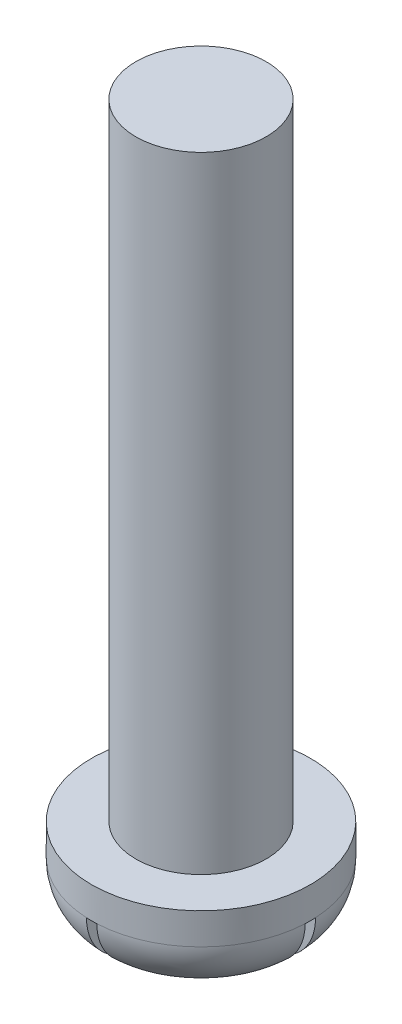
ISO-10303-21;
HEADER;
FILE_DESCRIPTION(('STEP AP214'),'2;1');
FILE_NAME('part.step','',(''),(''),'','','');
FILE_SCHEMA(('AUTOMOTIVE_DESIGN { 1 0 10303 214 1 1 1 1 }'));
ENDSEC;
DATA;
#1=APPLICATION_CONTEXT('core data for automotive mechanical design processes');
#2=APPLICATION_PROTOCOL_DEFINITION('international standard','automotive_design',2000,#1);
#3=PRODUCT_CONTEXT('',#1,'mechanical');
#4=PRODUCT('Part','Part','',(#3));
#5=PRODUCT_RELATED_PRODUCT_CATEGORY('part','',(#4));
#6=PRODUCT_DEFINITION_FORMATION('','',#4);
#7=PRODUCT_DEFINITION_CONTEXT('part definition',#1,'design');
#8=PRODUCT_DEFINITION('design','',#6,#7);
#9=PRODUCT_DEFINITION_SHAPE('','',#8);
#10=(LENGTH_UNIT() NAMED_UNIT(*) SI_UNIT(.MILLI.,.METRE.));
#11=(NAMED_UNIT(*) PLANE_ANGLE_UNIT() SI_UNIT($,.RADIAN.));
#12=(NAMED_UNIT(*) SI_UNIT($,.STERADIAN.) SOLID_ANGLE_UNIT());
#13=UNCERTAINTY_MEASURE_WITH_UNIT(LENGTH_MEASURE(1.E-05),#10,'distance_accuracy_value','');
#14=(GEOMETRIC_REPRESENTATION_CONTEXT(3) GLOBAL_UNCERTAINTY_ASSIGNED_CONTEXT((#13)) GLOBAL_UNIT_ASSIGNED_CONTEXT((#10,
#11,#12)) REPRESENTATION_CONTEXT('',''));
#15=CARTESIAN_POINT('',(0.,0.,0.));
#16=DIRECTION('',(0.,0.,1.));
#17=DIRECTION('',(1.,0.,0.));
#18=AXIS2_PLACEMENT_3D('',#15,#16,#17);
#19=CARTESIAN_POINT('',(0.,-1.6,0.));
#20=DIRECTION('',(0.,1.,0.));
#21=DIRECTION('',(0.,0.,1.));
#22=AXIS2_PLACEMENT_3D('',#19,#20,#21);
#23=CYLINDRICAL_SURFACE('',#22,2.1);
#24=CARTESIAN_POINT('',(0.,0.,0.));
#25=DIRECTION('',(0.,1.,0.));
#26=DIRECTION('',(0.,0.,1.));
#27=AXIS2_PLACEMENT_3D('',#24,#25,#26);
#28=CIRCLE('',#27,2.1);
#29=CARTESIAN_POINT('',(0.,0.,2.1));
#30=VERTEX_POINT('',#29);
#31=EDGE_CURVE('E244',#30,#30,#28,.T.);
#32=ORIENTED_EDGE('',*,*,#31,.F.);
#33=EDGE_LOOP('',(#32));
#34=FACE_BOUND('',#33,.T.);
#35=CARTESIAN_POINT('',(0.,-0.6,0.));
#36=DIRECTION('',(0.,1.,0.));
#37=DIRECTION('',(0.,0.,1.));
#38=AXIS2_PLACEMENT_3D('',#35,#36,#37);
#39=CIRCLE('',#38,2.1);
#40=CARTESIAN_POINT('',(0.100000000000001,-0.6,2.0976176963403));
#41=VERTEX_POINT('',#40);
#42=CARTESIAN_POINT('',(-0.0999999999999995,-0.6,2.0976176963403));
#43=VERTEX_POINT('',#42);
#44=EDGE_CURVE('E281',#41,#43,#39,.F.);
#45=ORIENTED_EDGE('',*,*,#44,.F.);
#46=CARTESIAN_POINT('',(0.,-0.6,0.));
#47=DIRECTION('',(0.,1.,0.));
#48=DIRECTION('',(0.,0.,1.));
#49=AXIS2_PLACEMENT_3D('',#46,#47,#48);
#50=CIRCLE('',#49,2.1);
#51=CARTESIAN_POINT('',(2.0976176963403,-0.6,0.1));
#52=VERTEX_POINT('',#51);
#53=EDGE_CURVE('E294',#41,#52,#50,.T.);
#54=ORIENTED_EDGE('',*,*,#53,.T.);
#55=CARTESIAN_POINT('',(2.0976176963403,-0.6,-0.1));
#56=VERTEX_POINT('',#55);
#57=EDGE_CURVE('E387',#56,#52,#39,.F.);
#58=ORIENTED_EDGE('',*,*,#57,.F.);
#59=CARTESIAN_POINT('',(0.,-0.6,0.));
#60=DIRECTION('',(0.,1.,0.));
#61=DIRECTION('',(0.,0.,1.));
#62=AXIS2_PLACEMENT_3D('',#59,#60,#61);
#63=CIRCLE('',#62,2.1);
#64=CARTESIAN_POINT('',(0.100000000000001,-0.6,-2.0976176963403));
#65=VERTEX_POINT('',#64);
#66=EDGE_CURVE('E282',#56,#65,#63,.T.);
#67=ORIENTED_EDGE('',*,*,#66,.T.);
#68=CARTESIAN_POINT('',(-0.0999999999999995,-0.6,-2.0976176963403));
#69=VERTEX_POINT('',#68);
#70=EDGE_CURVE('E278',#69,#65,#39,.F.);
#71=ORIENTED_EDGE('',*,*,#70,.F.);
#72=CARTESIAN_POINT('',(0.,-0.6,0.));
#73=DIRECTION('',(0.,1.,0.));
#74=DIRECTION('',(0.,0.,1.));
#75=AXIS2_PLACEMENT_3D('',#72,#73,#74);
#76=CIRCLE('',#75,2.1);
#77=CARTESIAN_POINT('',(-2.0976176963403,-0.6,-0.1));
#78=VERTEX_POINT('',#77);
#79=EDGE_CURVE('E286',#69,#78,#76,.T.);
#80=ORIENTED_EDGE('',*,*,#79,.T.);
#81=CARTESIAN_POINT('',(-2.0976176963403,-0.6,0.1));
#82=VERTEX_POINT('',#81);
#83=EDGE_CURVE('E196',#82,#78,#39,.F.);
#84=ORIENTED_EDGE('',*,*,#83,.F.);
#85=CARTESIAN_POINT('',(0.,-0.6,0.));
#86=DIRECTION('',(0.,1.,0.));
#87=DIRECTION('',(0.,0.,1.));
#88=AXIS2_PLACEMENT_3D('',#85,#86,#87);
#89=CIRCLE('',#88,2.1);
#90=EDGE_CURVE('E290',#82,#43,#89,.T.);
#91=ORIENTED_EDGE('',*,*,#90,.T.);
#92=EDGE_LOOP('',(#45,#54,#58,#67,#71,#80,#84,#91));
#93=FACE_BOUND('',#92,.T.);
#94=ADVANCED_FACE('F91',(#34,#93),#23,.T.);
#95=CARTESIAN_POINT('',(0.,-1.6,0.));
#96=DIRECTION('',(0.,1.,0.));
#97=DIRECTION('',(0.,0.,1.));
#98=AXIS2_PLACEMENT_3D('',#95,#96,#97);
#99=PLANE('',#98);
#100=DIRECTION('',(1.,0.,0.));
#101=VECTOR('',#100,1.);
#102=CARTESIAN_POINT('',(0.,-1.6,-0.1));
#103=LINE('',#102,#101);
#104=CARTESIAN_POINT('',(-1.09544511501033,-1.6,-0.1));
#105=VERTEX_POINT('',#104);
#106=CARTESIAN_POINT('',(-0.0999999999999994,-1.6,-0.1));
#107=VERTEX_POINT('',#106);
#108=EDGE_CURVE('E207',#105,#107,#103,.T.);
#109=ORIENTED_EDGE('',*,*,#108,.F.);
#110=CARTESIAN_POINT('',(0.,-1.6,0.));
#111=DIRECTION('',(0.,1.,0.));
#112=DIRECTION('',(0.,0.,1.));
#113=AXIS2_PLACEMENT_3D('',#110,#111,#112);
#114=CIRCLE('',#113,1.1);
#115=CARTESIAN_POINT('',(-0.0999999999999995,-1.6,-1.09544511501033));
#116=VERTEX_POINT('',#115);
#117=EDGE_CURVE('E373',#105,#116,#114,.F.);
#118=ORIENTED_EDGE('',*,*,#117,.T.);
#119=DIRECTION('',(0.,0.,1.));
#120=VECTOR('',#119,1.);
#121=CARTESIAN_POINT('',(-0.0999999999999995,-1.6,0.));
#122=LINE('',#121,#120);
#123=EDGE_CURVE('E273',#116,#107,#122,.T.);
#124=ORIENTED_EDGE('',*,*,#123,.T.);
#125=EDGE_LOOP('',(#109,#118,#124));
#126=FACE_BOUND('',#125,.T.);
#127=ADVANCED_FACE('F410',(#126),#99,.F.);
#128=DIRECTION('',(0.,0.,1.));
#129=VECTOR('',#128,1.);
#130=CARTESIAN_POINT('',(0.100000000000001,-1.6,0.));
#131=LINE('',#130,#129);
#132=CARTESIAN_POINT('',(0.100000000000001,-1.6,-1.09544511501033));
#133=VERTEX_POINT('',#132);
#134=CARTESIAN_POINT('',(0.100000000000001,-1.6,-0.1));
#135=VERTEX_POINT('',#134);
#136=EDGE_CURVE('E267',#133,#135,#131,.T.);
#137=ORIENTED_EDGE('',*,*,#136,.F.);
#138=CARTESIAN_POINT('',(0.,-1.6,0.));
#139=DIRECTION('',(0.,1.,0.));
#140=DIRECTION('',(0.,0.,1.));
#141=AXIS2_PLACEMENT_3D('',#138,#139,#140);
#142=CIRCLE('',#141,1.1);
#143=CARTESIAN_POINT('',(1.09544511501033,-1.6,-0.1));
#144=VERTEX_POINT('',#143);
#145=EDGE_CURVE('E106',#133,#144,#142,.F.);
#146=ORIENTED_EDGE('',*,*,#145,.T.);
#147=DIRECTION('',(1.,0.,0.));
#148=VECTOR('',#147,1.);
#149=CARTESIAN_POINT('',(0.,-1.6,-0.1));
#150=LINE('',#149,#148);
#151=EDGE_CURVE('E270',#135,#144,#150,.T.);
#152=ORIENTED_EDGE('',*,*,#151,.F.);
#153=EDGE_LOOP('',(#137,#146,#152));
#154=FACE_BOUND('',#153,.T.);
#155=ADVANCED_FACE('F407',(#154),#99,.F.);
#156=DIRECTION('',(0.,0.,1.));
#157=VECTOR('',#156,1.);
#158=CARTESIAN_POINT('',(-0.0999999999999995,-1.6,0.));
#159=LINE('',#158,#157);
#160=CARTESIAN_POINT('',(-0.0999999999999994,-1.6,0.1));
#161=VERTEX_POINT('',#160);
#162=CARTESIAN_POINT('',(-0.0999999999999995,-1.6,1.09544511501033));
#163=VERTEX_POINT('',#162);
#164=EDGE_CURVE('E260',#161,#163,#159,.T.);
#165=ORIENTED_EDGE('',*,*,#164,.T.);
#166=CARTESIAN_POINT('',(0.,-1.6,0.));
#167=DIRECTION('',(0.,1.,0.));
#168=DIRECTION('',(0.,0.,1.));
#169=AXIS2_PLACEMENT_3D('',#166,#167,#168);
#170=CIRCLE('',#169,1.1);
#171=CARTESIAN_POINT('',(-1.09544511501033,-1.6,0.1));
#172=VERTEX_POINT('',#171);
#173=EDGE_CURVE('E333',#163,#172,#170,.F.);
#174=ORIENTED_EDGE('',*,*,#173,.T.);
#175=DIRECTION('',(1.,0.,0.));
#176=VECTOR('',#175,1.);
#177=CARTESIAN_POINT('',(0.,-1.6,0.1));
#178=LINE('',#177,#176);
#179=EDGE_CURVE('E264',#172,#161,#178,.T.);
#180=ORIENTED_EDGE('',*,*,#179,.T.);
#181=EDGE_LOOP('',(#165,#174,#180));
#182=FACE_BOUND('',#181,.T.);
#183=ADVANCED_FACE('F409',(#182),#99,.F.);
#184=DIRECTION('',(1.,0.,0.));
#185=VECTOR('',#184,1.);
#186=CARTESIAN_POINT('',(0.,-1.6,0.1));
#187=LINE('',#186,#185);
#188=CARTESIAN_POINT('',(0.100000000000001,-1.6,0.0999999999999998));
#189=VERTEX_POINT('',#188);
#190=CARTESIAN_POINT('',(1.09544511501033,-1.6,0.1));
#191=VERTEX_POINT('',#190);
#192=EDGE_CURVE('E256',#189,#191,#187,.T.);
#193=ORIENTED_EDGE('',*,*,#192,.T.);
#194=CARTESIAN_POINT('',(0.,-1.6,0.));
#195=DIRECTION('',(0.,1.,0.));
#196=DIRECTION('',(0.,0.,1.));
#197=AXIS2_PLACEMENT_3D('',#194,#195,#196);
#198=CIRCLE('',#197,1.1);
#199=CARTESIAN_POINT('',(0.100000000000001,-1.6,1.09544511501033));
#200=VERTEX_POINT('',#199);
#201=EDGE_CURVE('E307',#191,#200,#198,.F.);
#202=ORIENTED_EDGE('',*,*,#201,.T.);
#203=DIRECTION('',(0.,0.,1.));
#204=VECTOR('',#203,1.);
#205=CARTESIAN_POINT('',(0.100000000000001,-1.6,0.));
#206=LINE('',#205,#204);
#207=EDGE_CURVE('E249',#189,#200,#206,.T.);
#208=ORIENTED_EDGE('',*,*,#207,.F.);
#209=EDGE_LOOP('',(#193,#202,#208));
#210=FACE_BOUND('',#209,.T.);
#211=ADVANCED_FACE('F416',(#210),#99,.F.);
#212=CARTESIAN_POINT('',(0.,0.,0.));
#213=DIRECTION('',(0.,1.,0.));
#214=DIRECTION('',(0.,0.,1.));
#215=AXIS2_PLACEMENT_3D('',#212,#213,#214);
#216=PLANE('',#215);
#217=CARTESIAN_POINT('',(0.,0.,0.));
#218=DIRECTION('',(0.,1.,0.));
#219=DIRECTION('',(0.,0.,1.));
#220=AXIS2_PLACEMENT_3D('',#217,#218,#219);
#221=CIRCLE('',#220,1.25);
#222=CARTESIAN_POINT('',(0.,0.,1.25));
#223=VERTEX_POINT('',#222);
#224=EDGE_CURVE('E245',#223,#223,#221,.T.);
#225=ORIENTED_EDGE('',*,*,#224,.F.);
#226=EDGE_LOOP('',(#225));
#227=FACE_BOUND('',#226,.T.);
#228=ORIENTED_EDGE('',*,*,#31,.T.);
#229=EDGE_LOOP('',(#228));
#230=FACE_BOUND('',#229,.T.);
#231=ADVANCED_FACE('F426',(#227,#230),#216,.T.);
#232=CARTESIAN_POINT('',(0.,12.,0.));
#233=DIRECTION('',(0.,-1.,0.));
#234=DIRECTION('',(0.,0.,-1.));
#235=AXIS2_PLACEMENT_3D('',#232,#233,#234);
#236=CYLINDRICAL_SURFACE('',#235,1.25);
#237=CARTESIAN_POINT('',(0.,12.,0.));
#238=DIRECTION('',(0.,1.,0.));
#239=DIRECTION('',(0.,0.,1.));
#240=AXIS2_PLACEMENT_3D('',#237,#238,#239);
#241=CIRCLE('',#240,1.25);
#242=CARTESIAN_POINT('',(0.,12.,1.25));
#243=VERTEX_POINT('',#242);
#244=EDGE_CURVE('E240',#243,#243,#241,.T.);
#245=ORIENTED_EDGE('',*,*,#244,.F.);
#246=EDGE_LOOP('',(#245));
#247=FACE_BOUND('',#246,.T.);
#248=ORIENTED_EDGE('',*,*,#224,.T.);
#249=EDGE_LOOP('',(#248));
#250=FACE_BOUND('',#249,.T.);
#251=ADVANCED_FACE('F428',(#247,#250),#236,.T.);
#252=CARTESIAN_POINT('',(0.,12.,0.));
#253=DIRECTION('',(0.,1.,0.));
#254=DIRECTION('',(0.,0.,1.));
#255=AXIS2_PLACEMENT_3D('',#252,#253,#254);
#256=PLANE('',#255);
#257=ORIENTED_EDGE('',*,*,#244,.T.);
#258=EDGE_LOOP('',(#257));
#259=FACE_BOUND('',#258,.T.);
#260=ADVANCED_FACE('F434',(#259),#256,.T.);
#261=CARTESIAN_POINT('',(-2.1,-1.600012,-0.1));
#262=DIRECTION('',(0.,0.,1.));
#263=DIRECTION('',(1.,0.,0.));
#264=AXIS2_PLACEMENT_3D('',#261,#262,#263);
#265=PLANE('',#264);
#266=ORIENTED_EDGE('',*,*,#151,.T.);
#267=CARTESIAN_POINT('',(1.09544511501033,-1.6,-0.1));
#268=CARTESIAN_POINT('',(1.14186190779381,-1.60001905521129,-0.1));
#269=CARTESIAN_POINT('',(1.18826367368777,-1.59679512757957,-0.1));
#270=CARTESIAN_POINT('',(1.28021602628602,-1.58399001900896,-0.1));
#271=CARTESIAN_POINT('',(1.32576597594862,-1.57440426156399,-0.1));
#272=CARTESIAN_POINT('',(1.42483554827466,-1.5462441660769,-0.1));
#273=CARTESIAN_POINT('',(1.47793547814189,-1.52616897044956,-0.1));
#274=CARTESIAN_POINT('',(1.57999150978688,-1.47735764140283,-0.1));
#275=CARTESIAN_POINT('',(1.62894700327203,-1.44862023941599,-0.1));
#276=CARTESIAN_POINT('',(1.72113864589878,-1.3834176484617,-0.1));
#277=CARTESIAN_POINT('',(1.76439530318889,-1.34698147058683,-0.1));
#278=CARTESIAN_POINT('',(1.84416183740948,-1.26735037200762,-0.1));
#279=CARTESIAN_POINT('',(1.88067175274648,-1.22415548978048,-0.1));
#280=CARTESIAN_POINT('',(1.94583676372823,-1.13232703786904,-0.1));
#281=CARTESIAN_POINT('',(1.97450673661032,-1.08370401926675,-0.1));
#282=CARTESIAN_POINT('',(2.02326478740058,-0.982330654193216,-0.1));
#283=CARTESIAN_POINT('',(2.04335449510947,-0.929581093802891,-0.1));
#284=CARTESIAN_POINT('',(2.07170274416937,-0.830795389104579,-0.1));
#285=CARTESIAN_POINT('',(2.08140257776887,-0.785166628460029,-0.1));
#286=CARTESIAN_POINT('',(2.09436769692562,-0.693030596831503,-0.1));
#287=CARTESIAN_POINT('',(2.0976365690065,-0.64652383012831,-0.1));
#288=CARTESIAN_POINT('',(2.0976176963403,-0.6,-0.1));
#289=B_SPLINE_CURVE_WITH_KNOTS('',3,(#267,#268,#269,#270,#271,#272,#273,#274,#275,#276,#277,
#278,#279,#280,#281,#282,#283,#284,#285,#286,#287,#288),.UNSPECIFIED.,.F.,.F.,(4,2,2,2,2,2,2,2,
2,2,4),(0.,0.139110184013551,0.278320548271493,0.447789167987185,0.617282618202234,
0.786148411884154,0.955013244250847,1.1235553757429,1.29206547880935,1.43156903794151,
1.57099477437158),.UNSPECIFIED.);
#290=EDGE_CURVE('E12',#144,#56,#289,.T.);
#291=ORIENTED_EDGE('',*,*,#290,.T.);
#292=DIRECTION('',(1.,0.,0.));
#293=VECTOR('',#292,1.);
#294=CARTESIAN_POINT('',(-2.1,-0.6,-0.1));
#295=LINE('',#294,#293);
#296=CARTESIAN_POINT('',(0.100000000000001,-0.6,-0.1));
#297=VERTEX_POINT('',#296);
#298=EDGE_CURVE('E200',#297,#56,#295,.T.);
#299=ORIENTED_EDGE('',*,*,#298,.F.);
#300=DIRECTION('',(0.,-1.,0.));
#301=VECTOR('',#300,1.);
#302=CARTESIAN_POINT('',(0.100000000000001,-1.600012,-0.1));
#303=LINE('',#302,#301);
#304=EDGE_CURVE('E236',#297,#135,#303,.T.);
#305=ORIENTED_EDGE('',*,*,#304,.T.);
#306=EDGE_LOOP('',(#266,#291,#299,#305));
#307=FACE_BOUND('',#306,.T.);
#308=ADVANCED_FACE('F406',(#307),#265,.T.);
#309=CARTESIAN_POINT('',(-2.1,-1.600012,0.1));
#310=DIRECTION('',(0.,0.,1.));
#311=DIRECTION('',(1.,0.,0.));
#312=AXIS2_PLACEMENT_3D('',#309,#310,#311);
#313=PLANE('',#312);
#314=DIRECTION('',(1.,0.,0.));
#315=VECTOR('',#314,1.);
#316=CARTESIAN_POINT('',(-2.1,-0.6,0.1));
#317=LINE('',#316,#315);
#318=CARTESIAN_POINT('',(0.100000000000001,-0.6,0.1));
#319=VERTEX_POINT('',#318);
#320=EDGE_CURVE('E199',#319,#52,#317,.T.);
#321=ORIENTED_EDGE('',*,*,#320,.T.);
#322=CARTESIAN_POINT('',(2.0976176963403,-0.6,0.1));
#323=CARTESIAN_POINT('',(2.09761751809997,-0.628107937004535,0.1));
#324=CARTESIAN_POINT('',(2.09643052097603,-0.656202403787026,0.1));
#325=CARTESIAN_POINT('',(2.09169516746274,-0.712190194861874,0.1));
#326=CARTESIAN_POINT('',(2.08814692730227,-0.740083528986395,0.1));
#327=CARTESIAN_POINT('',(2.07399437943265,-0.823112037767371,0.1));
#328=CARTESIAN_POINT('',(2.05988214885707,-0.877690887250937,0.1));
#329=CARTESIAN_POINT('',(2.02269598845795,-0.983702831948745,0.1));
#330=CARTESIAN_POINT('',(1.99961781373956,-1.03513442373427,0.1));
#331=CARTESIAN_POINT('',(1.94515928310321,-1.13339360568844,0.1));
#332=CARTESIAN_POINT('',(1.91378032076735,-1.18022196686452,0.1));
#333=CARTESIAN_POINT('',(1.84360156021976,-1.26796298540339,0.1));
#334=CARTESIAN_POINT('',(1.80479942657199,-1.30887377388062,0.1));
#335=CARTESIAN_POINT('',(1.72087521242129,-1.38361624820673,0.1));
#336=CARTESIAN_POINT('',(1.67575197624482,-1.41744663673421,0.1));
#337=CARTESIAN_POINT('',(1.58042226435792,-1.47710230635077,0.1));
#338=CARTESIAN_POINT('',(1.53020972617258,-1.50291788778767,0.1));
#339=CARTESIAN_POINT('',(1.42617781599119,-1.5457600095986,0.1));
#340=CARTESIAN_POINT('',(1.37236036783324,-1.56279119639188,0.1));
#341=CARTESIAN_POINT('',(1.28109651546064,-1.58344759788997,0.1));
#342=CARTESIAN_POINT('',(1.244213037713,-1.58965325144868,0.1));
#343=CARTESIAN_POINT('',(1.17003950013938,-1.59792913150927,0.1));
#344=CARTESIAN_POINT('',(1.13275011198035,-1.60000537799327,0.1));
#345=CARTESIAN_POINT('',(1.09544511501033,-1.6,0.1));
#346=B_SPLINE_CURVE_WITH_KNOTS('',3,(#322,#323,#324,#325,#326,#327,#328,#329,#330,#331,#332,
#333,#334,#335,#336,#337,#338,#339,#340,#341,#342,#343,#344,#345),.UNSPECIFIED.,.F.,.F.,(4,2,2,
2,2,2,2,2,2,2,2,4),(0.,0.0842720014103741,0.168539854956875,0.336793691814272,0.505127285128272,
0.673432635584268,0.84179102465564,1.01018023459852,1.17877244464346,1.34727538780839,
1.45926517865547,1.57109158717155),.UNSPECIFIED.);
#347=EDGE_CURVE('E298',#52,#191,#346,.T.);
#348=ORIENTED_EDGE('',*,*,#347,.T.);
#349=ORIENTED_EDGE('',*,*,#192,.F.);
#350=DIRECTION('',(0.,-1.,0.));
#351=VECTOR('',#350,1.);
#352=CARTESIAN_POINT('',(0.100000000000001,-1.600012,0.1));
#353=LINE('',#352,#351);
#354=EDGE_CURVE('E233',#319,#189,#353,.T.);
#355=ORIENTED_EDGE('',*,*,#354,.F.);
#356=EDGE_LOOP('',(#321,#348,#349,#355));
#357=FACE_BOUND('',#356,.T.);
#358=ADVANCED_FACE('F318',(#357),#313,.F.);
#359=CARTESIAN_POINT('',(-0.0999999999999994,-0.6,-0.1));
#360=VERTEX_POINT('',#359);
#361=EDGE_CURVE('E187',#78,#360,#295,.T.);
#362=ORIENTED_EDGE('',*,*,#361,.F.);
#363=CARTESIAN_POINT('',(-2.0976176963403,-0.6,-0.1));
#364=CARTESIAN_POINT('',(-2.09761751809997,-0.628107937004535,-0.1));
#365=CARTESIAN_POINT('',(-2.09643052097603,-0.656202403787026,-0.1));
#366=CARTESIAN_POINT('',(-2.09169516746274,-0.712190194861874,-0.1));
#367=CARTESIAN_POINT('',(-2.08814692730227,-0.740083528986395,-0.1));
#368=CARTESIAN_POINT('',(-2.07399437943265,-0.823112037767371,-0.1));
#369=CARTESIAN_POINT('',(-2.05988214885707,-0.877690887250937,-0.1));
#370=CARTESIAN_POINT('',(-2.02269598845795,-0.983702831948745,-0.1));
#371=CARTESIAN_POINT('',(-1.99961781373956,-1.03513442373427,-0.1));
#372=CARTESIAN_POINT('',(-1.94515928310321,-1.13339360568844,-0.1));
#373=CARTESIAN_POINT('',(-1.91378032076735,-1.18022196686452,-0.1));
#374=CARTESIAN_POINT('',(-1.84360156021976,-1.26796298540339,-0.1));
#375=CARTESIAN_POINT('',(-1.80479942657199,-1.30887377388062,-0.1));
#376=CARTESIAN_POINT('',(-1.72087521242129,-1.38361624820673,-0.1));
#377=CARTESIAN_POINT('',(-1.67575197624482,-1.41744663673421,-0.1));
#378=CARTESIAN_POINT('',(-1.58042226435792,-1.47710230635077,-0.1));
#379=CARTESIAN_POINT('',(-1.53020972617258,-1.50291788778767,-0.1));
#380=CARTESIAN_POINT('',(-1.42617781599119,-1.5457600095986,-0.1));
#381=CARTESIAN_POINT('',(-1.37236036783324,-1.56279119639188,-0.1));
#382=CARTESIAN_POINT('',(-1.28109651546064,-1.58344759788997,-0.1));
#383=CARTESIAN_POINT('',(-1.244213037713,-1.58965325144868,-0.1));
#384=CARTESIAN_POINT('',(-1.17003950013938,-1.59792913150927,-0.1));
#385=CARTESIAN_POINT('',(-1.13275011198035,-1.60000537799327,-0.1));
#386=CARTESIAN_POINT('',(-1.09544511501033,-1.6,-0.1));
#387=B_SPLINE_CURVE_WITH_KNOTS('',3,(#363,#364,#365,#366,#367,#368,#369,#370,#371,#372,#373,
#374,#375,#376,#377,#378,#379,#380,#381,#382,#383,#384,#385,#386),.UNSPECIFIED.,.F.,.F.,(4,2,2,
2,2,2,2,2,2,2,2,4),(0.,0.0842720014103741,0.168539854956875,0.336793691814272,0.505127285128272,
0.673432635584268,0.84179102465564,1.01018023459852,1.17877244464346,1.34727538780839,
1.45926517865547,1.57109158717155),.UNSPECIFIED.);
#388=EDGE_CURVE('E332',#78,#105,#387,.T.);
#389=ORIENTED_EDGE('',*,*,#388,.T.);
#390=ORIENTED_EDGE('',*,*,#108,.T.);
#391=DIRECTION('',(0.,1.,0.));
#392=VECTOR('',#391,1.);
#393=CARTESIAN_POINT('',(-0.0999999999999994,-0.6,-0.1));
#394=LINE('',#393,#392);
#395=EDGE_CURVE('E204',#107,#360,#394,.T.);
#396=ORIENTED_EDGE('',*,*,#395,.T.);
#397=EDGE_LOOP('',(#362,#389,#390,#396));
#398=FACE_BOUND('',#397,.T.);
#399=ADVANCED_FACE('F205',(#398),#265,.T.);
#400=ORIENTED_EDGE('',*,*,#179,.F.);
#401=CARTESIAN_POINT('',(-1.09544511501033,-1.6,0.1));
#402=CARTESIAN_POINT('',(-1.14186190779381,-1.60001905521129,0.1));
#403=CARTESIAN_POINT('',(-1.18826367368777,-1.59679512757957,0.1));
#404=CARTESIAN_POINT('',(-1.28021602628602,-1.58399001900896,0.1));
#405=CARTESIAN_POINT('',(-1.32576597594862,-1.57440426156399,0.1));
#406=CARTESIAN_POINT('',(-1.42483554827466,-1.5462441660769,0.1));
#407=CARTESIAN_POINT('',(-1.47793547814189,-1.52616897044956,0.1));
#408=CARTESIAN_POINT('',(-1.57999150978688,-1.47735764140283,0.1));
#409=CARTESIAN_POINT('',(-1.62894700327203,-1.44862023941599,0.1));
#410=CARTESIAN_POINT('',(-1.72113864589878,-1.3834176484617,0.1));
#411=CARTESIAN_POINT('',(-1.76439530318889,-1.34698147058683,0.1));
#412=CARTESIAN_POINT('',(-1.84416183740948,-1.26735037200762,0.1));
#413=CARTESIAN_POINT('',(-1.88067175274648,-1.22415548978048,0.1));
#414=CARTESIAN_POINT('',(-1.94583676372823,-1.13232703786904,0.1));
#415=CARTESIAN_POINT('',(-1.97450673661032,-1.08370401926675,0.1));
#416=CARTESIAN_POINT('',(-2.02326478740058,-0.982330654193216,0.1));
#417=CARTESIAN_POINT('',(-2.04335449510947,-0.929581093802891,0.1));
#418=CARTESIAN_POINT('',(-2.07170274416937,-0.830795389104579,0.1));
#419=CARTESIAN_POINT('',(-2.08140257776887,-0.785166628460029,0.1));
#420=CARTESIAN_POINT('',(-2.09436769692562,-0.693030596831503,0.1));
#421=CARTESIAN_POINT('',(-2.0976365690065,-0.64652383012831,0.1));
#422=CARTESIAN_POINT('',(-2.0976176963403,-0.6,0.1));
#423=B_SPLINE_CURVE_WITH_KNOTS('',3,(#401,#402,#403,#404,#405,#406,#407,#408,#409,#410,#411,
#412,#413,#414,#415,#416,#417,#418,#419,#420,#421,#422),.UNSPECIFIED.,.F.,.F.,(4,2,2,2,2,2,2,2,
2,2,4),(0.,0.139110184013551,0.278320548271493,0.447789167987185,0.617282618202234,
0.786148411884154,0.955013244250847,1.1235553757429,1.29206547880935,1.43156903794151,
1.57099477437158),.UNSPECIFIED.);
#424=EDGE_CURVE('E324',#172,#82,#423,.T.);
#425=ORIENTED_EDGE('',*,*,#424,.T.);
#426=CARTESIAN_POINT('',(-0.0999999999999994,-0.6,0.1));
#427=VERTEX_POINT('',#426);
#428=EDGE_CURVE('E230',#82,#427,#317,.T.);
#429=ORIENTED_EDGE('',*,*,#428,.T.);
#430=DIRECTION('',(0.,1.,0.));
#431=VECTOR('',#430,1.);
#432=CARTESIAN_POINT('',(-0.0999999999999994,-0.6,0.1));
#433=LINE('',#432,#431);
#434=EDGE_CURVE('E211',#161,#427,#433,.T.);
#435=ORIENTED_EDGE('',*,*,#434,.F.);
#436=EDGE_LOOP('',(#400,#425,#429,#435));
#437=FACE_BOUND('',#436,.T.);
#438=ADVANCED_FACE('F313',(#437),#313,.F.);
#439=CARTESIAN_POINT('',(-0.0999999999999995,-0.6,2.1));
#440=DIRECTION('',(-1.,0.,0.));
#441=DIRECTION('',(0.,0.,1.));
#442=AXIS2_PLACEMENT_3D('',#439,#440,#441);
#443=PLANE('',#442);
#444=ORIENTED_EDGE('',*,*,#123,.F.);
#445=CARTESIAN_POINT('',(-0.0999999999999995,-1.6,-1.09544511501033));
#446=CARTESIAN_POINT('',(-0.0999999999999995,-1.60001905521129,-1.14186190779381));
#447=CARTESIAN_POINT('',(-0.0999999999999995,-1.59679512757957,-1.18826367368777));
#448=CARTESIAN_POINT('',(-0.0999999999999995,-1.58399001900896,-1.28021602628602));
#449=CARTESIAN_POINT('',(-0.0999999999999995,-1.57440426156399,-1.32576597594862));
#450=CARTESIAN_POINT('',(-0.0999999999999995,-1.5462441660769,-1.42483554827466));
#451=CARTESIAN_POINT('',(-0.0999999999999995,-1.52616897044956,-1.47793547814189));
#452=CARTESIAN_POINT('',(-0.0999999999999995,-1.47735764140283,-1.57999150978688));
#453=CARTESIAN_POINT('',(-0.0999999999999995,-1.44862023941599,-1.62894700327203));
#454=CARTESIAN_POINT('',(-0.0999999999999995,-1.3834176484617,-1.72113864589878));
#455=CARTESIAN_POINT('',(-0.0999999999999995,-1.34698147058683,-1.76439530318889));
#456=CARTESIAN_POINT('',(-0.0999999999999995,-1.26735037200762,-1.84416183740948));
#457=CARTESIAN_POINT('',(-0.0999999999999995,-1.22415548978048,-1.88067175274648));
#458=CARTESIAN_POINT('',(-0.0999999999999995,-1.13232703786904,-1.94583676372823));
#459=CARTESIAN_POINT('',(-0.0999999999999995,-1.08370401926675,-1.97450673661032));
#460=CARTESIAN_POINT('',(-0.0999999999999995,-0.982330654193216,-2.02326478740058));
#461=CARTESIAN_POINT('',(-0.0999999999999995,-0.929581093802891,-2.04335449510947));
#462=CARTESIAN_POINT('',(-0.0999999999999995,-0.830795389104578,-2.07170274416937));
#463=CARTESIAN_POINT('',(-0.0999999999999995,-0.785166628460028,-2.08140257776887));
#464=CARTESIAN_POINT('',(-0.0999999999999995,-0.693030596831502,-2.09436769692562));
#465=CARTESIAN_POINT('',(-0.0999999999999995,-0.64652383012831,-2.0976365690065));
#466=CARTESIAN_POINT('',(-0.0999999999999995,-0.6,-2.0976176963403));
#467=B_SPLINE_CURVE_WITH_KNOTS('',3,(#445,#446,#447,#448,#449,#450,#451,#452,#453,#454,#455,
#456,#457,#458,#459,#460,#461,#462,#463,#464,#465,#466),.UNSPECIFIED.,.F.,.F.,(4,2,2,2,2,2,2,2,
2,2,4),(0.,0.139110184013551,0.278320548271493,0.447789167987185,0.617282618202234,
0.786148411884154,0.955013244250848,1.1235553757429,1.29206547880935,1.43156903794151,
1.57099477437158),.UNSPECIFIED.);
#468=EDGE_CURVE('E215',#116,#69,#467,.T.);
#469=ORIENTED_EDGE('',*,*,#468,.T.);
#470=DIRECTION('',(0.,0.,1.));
#471=VECTOR('',#470,1.);
#472=CARTESIAN_POINT('',(-0.0999999999999995,-0.6,2.1));
#473=LINE('',#472,#471);
#474=EDGE_CURVE('E193',#360,#69,#473,.F.);
#475=ORIENTED_EDGE('',*,*,#474,.F.);
#476=ORIENTED_EDGE('',*,*,#395,.F.);
#477=EDGE_LOOP('',(#444,#469,#475,#476));
#478=FACE_BOUND('',#477,.T.);
#479=ADVANCED_FACE('F213',(#478),#443,.F.);
#480=CARTESIAN_POINT('',(0.100000000000001,-0.6,2.1));
#481=DIRECTION('',(-1.,0.,0.));
#482=DIRECTION('',(0.,0.,1.));
#483=AXIS2_PLACEMENT_3D('',#480,#481,#482);
#484=PLANE('',#483);
#485=DIRECTION('',(0.,0.,1.));
#486=VECTOR('',#485,1.);
#487=CARTESIAN_POINT('',(0.100000000000001,-0.6,2.1));
#488=LINE('',#487,#486);
#489=EDGE_CURVE('E222',#297,#65,#488,.F.);
#490=ORIENTED_EDGE('',*,*,#489,.T.);
#491=CARTESIAN_POINT('',(0.100000000000001,-0.6,-2.0976176963403));
#492=CARTESIAN_POINT('',(0.100000000000001,-0.628107937004535,-2.09761751809997));
#493=CARTESIAN_POINT('',(0.100000000000001,-0.656202403787026,-2.09643052097603));
#494=CARTESIAN_POINT('',(0.100000000000001,-0.712190194861874,-2.09169516746274));
#495=CARTESIAN_POINT('',(0.100000000000001,-0.740083528986395,-2.08814692730227));
#496=CARTESIAN_POINT('',(0.100000000000001,-0.823112037767371,-2.07399437943265));
#497=CARTESIAN_POINT('',(0.100000000000001,-0.877690887250937,-2.05988214885707));
#498=CARTESIAN_POINT('',(0.100000000000001,-0.983702831948745,-2.02269598845795));
#499=CARTESIAN_POINT('',(0.100000000000001,-1.03513442373427,-1.99961781373956));
#500=CARTESIAN_POINT('',(0.100000000000001,-1.13339360568844,-1.94515928310321));
#501=CARTESIAN_POINT('',(0.100000000000001,-1.18022196686452,-1.91378032076735));
#502=CARTESIAN_POINT('',(0.100000000000001,-1.26796298540339,-1.84360156021976));
#503=CARTESIAN_POINT('',(0.100000000000001,-1.30887377388062,-1.80479942657199));
#504=CARTESIAN_POINT('',(0.100000000000001,-1.38361624820673,-1.72087521242129));
#505=CARTESIAN_POINT('',(0.100000000000001,-1.41744663673421,-1.67575197624482));
#506=CARTESIAN_POINT('',(0.100000000000001,-1.47710230635077,-1.58042226435792));
#507=CARTESIAN_POINT('',(0.100000000000001,-1.50291788778767,-1.53020972617258));
#508=CARTESIAN_POINT('',(0.100000000000001,-1.5457600095986,-1.42617781599119));
#509=CARTESIAN_POINT('',(0.100000000000001,-1.56279119639188,-1.37236036783324));
#510=CARTESIAN_POINT('',(0.100000000000001,-1.58344759788997,-1.28109651546064));
#511=CARTESIAN_POINT('',(0.100000000000001,-1.58965325144868,-1.244213037713));
#512=CARTESIAN_POINT('',(0.100000000000001,-1.59792913150927,-1.17003950013938));
#513=CARTESIAN_POINT('',(0.100000000000001,-1.60000537799327,-1.13275011198034));
#514=CARTESIAN_POINT('',(0.100000000000001,-1.6,-1.09544511501033));
#515=B_SPLINE_CURVE_WITH_KNOTS('',3,(#491,#492,#493,#494,#495,#496,#497,#498,#499,#500,#501,
#502,#503,#504,#505,#506,#507,#508,#509,#510,#511,#512,#513,#514),.UNSPECIFIED.,.F.,.F.,(4,2,2,
2,2,2,2,2,2,2,2,4),(0.,0.0842720014103741,0.168539854956875,0.336793691814272,0.505127285128272,
0.673432635584268,0.84179102465564,1.01018023459852,1.17877244464345,1.34727538780839,
1.45926517865547,1.57109158717155),.UNSPECIFIED.);
#516=EDGE_CURVE('E120',#65,#133,#515,.T.);
#517=ORIENTED_EDGE('',*,*,#516,.T.);
#518=ORIENTED_EDGE('',*,*,#136,.T.);
#519=ORIENTED_EDGE('',*,*,#304,.F.);
#520=EDGE_LOOP('',(#490,#517,#518,#519));
#521=FACE_BOUND('',#520,.T.);
#522=ADVANCED_FACE('F397',(#521),#484,.T.);
#523=CARTESIAN_POINT('',(0.,-0.6,0.));
#524=DIRECTION('',(0.,1.,0.));
#525=DIRECTION('',(-1.,0.,0.));
#526=AXIS2_PLACEMENT_3D('',#523,#524,#525);
#527=PLANE('',#526);
#528=ORIENTED_EDGE('',*,*,#428,.F.);
#529=ORIENTED_EDGE('',*,*,#83,.T.);
#530=ORIENTED_EDGE('',*,*,#361,.T.);
#531=ORIENTED_EDGE('',*,*,#474,.T.);
#532=ORIENTED_EDGE('',*,*,#70,.T.);
#533=ORIENTED_EDGE('',*,*,#489,.F.);
#534=ORIENTED_EDGE('',*,*,#298,.T.);
#535=ORIENTED_EDGE('',*,*,#57,.T.);
#536=ORIENTED_EDGE('',*,*,#320,.F.);
#537=EDGE_CURVE('E224',#41,#319,#488,.F.);
#538=ORIENTED_EDGE('',*,*,#537,.F.);
#539=ORIENTED_EDGE('',*,*,#44,.T.);
#540=EDGE_CURVE('E218',#43,#427,#473,.F.);
#541=ORIENTED_EDGE('',*,*,#540,.T.);
#542=EDGE_LOOP('',(#528,#529,#530,#531,#532,#533,#534,#535,#536,#538,#539,#541));
#543=FACE_BOUND('',#542,.T.);
#544=ADVANCED_FACE('F190',(#543),#527,.F.);
#545=ORIENTED_EDGE('',*,*,#540,.F.);
#546=CARTESIAN_POINT('',(-0.0999999999999995,-0.6,2.0976176963403));
#547=CARTESIAN_POINT('',(-0.0999999999999995,-0.628107937004535,2.09761751809997));
#548=CARTESIAN_POINT('',(-0.0999999999999995,-0.656202403787026,2.09643052097603));
#549=CARTESIAN_POINT('',(-0.0999999999999995,-0.712190194861874,2.09169516746274));
#550=CARTESIAN_POINT('',(-0.0999999999999995,-0.740083528986395,2.08814692730227));
#551=CARTESIAN_POINT('',(-0.0999999999999995,-0.823112037767371,2.07399437943265));
#552=CARTESIAN_POINT('',(-0.0999999999999995,-0.877690887250937,2.05988214885707));
#553=CARTESIAN_POINT('',(-0.0999999999999995,-0.983702831948745,2.02269598845795));
#554=CARTESIAN_POINT('',(-0.0999999999999995,-1.03513442373427,1.99961781373956));
#555=CARTESIAN_POINT('',(-0.0999999999999995,-1.13339360568844,1.94515928310321));
#556=CARTESIAN_POINT('',(-0.0999999999999995,-1.18022196686452,1.91378032076735));
#557=CARTESIAN_POINT('',(-0.0999999999999995,-1.26796298540339,1.84360156021976));
#558=CARTESIAN_POINT('',(-0.0999999999999995,-1.30887377388062,1.80479942657199));
#559=CARTESIAN_POINT('',(-0.0999999999999995,-1.38361624820673,1.72087521242129));
#560=CARTESIAN_POINT('',(-0.0999999999999995,-1.41744663673421,1.67575197624482));
#561=CARTESIAN_POINT('',(-0.0999999999999995,-1.47710230635077,1.58042226435792));
#562=CARTESIAN_POINT('',(-0.0999999999999995,-1.50291788778767,1.53020972617258));
#563=CARTESIAN_POINT('',(-0.0999999999999995,-1.5457600095986,1.42617781599119));
#564=CARTESIAN_POINT('',(-0.0999999999999995,-1.56279119639188,1.37236036783324));
#565=CARTESIAN_POINT('',(-0.0999999999999995,-1.58344759788997,1.28109651546064));
#566=CARTESIAN_POINT('',(-0.0999999999999995,-1.58965325144868,1.244213037713));
#567=CARTESIAN_POINT('',(-0.0999999999999995,-1.59792913150927,1.17003950013938));
#568=CARTESIAN_POINT('',(-0.0999999999999995,-1.60000537799327,1.13275011198035));
#569=CARTESIAN_POINT('',(-0.0999999999999995,-1.6,1.09544511501033));
#570=B_SPLINE_CURVE_WITH_KNOTS('',3,(#546,#547,#548,#549,#550,#551,#552,#553,#554,#555,#556,
#557,#558,#559,#560,#561,#562,#563,#564,#565,#566,#567,#568,#569),.UNSPECIFIED.,.F.,.F.,(4,2,2,
2,2,2,2,2,2,2,2,4),(0.,0.0842720014103741,0.168539854956875,0.336793691814272,0.505127285128272,
0.673432635584268,0.84179102465564,1.01018023459852,1.17877244464345,1.34727538780839,
1.45926517865547,1.57109158717155),.UNSPECIFIED.);
#571=EDGE_CURVE('E347',#43,#163,#570,.T.);
#572=ORIENTED_EDGE('',*,*,#571,.T.);
#573=ORIENTED_EDGE('',*,*,#164,.F.);
#574=ORIENTED_EDGE('',*,*,#434,.T.);
#575=EDGE_LOOP('',(#545,#572,#573,#574));
#576=FACE_BOUND('',#575,.T.);
#577=ADVANCED_FACE('F359',(#576),#443,.F.);
#578=ORIENTED_EDGE('',*,*,#207,.T.);
#579=CARTESIAN_POINT('',(0.100000000000001,-1.6,1.09544511501033));
#580=CARTESIAN_POINT('',(0.100000000000001,-1.60001905521129,1.14186190779381));
#581=CARTESIAN_POINT('',(0.100000000000001,-1.59679512757957,1.18826367368777));
#582=CARTESIAN_POINT('',(0.100000000000001,-1.58399001900896,1.28021602628602));
#583=CARTESIAN_POINT('',(0.100000000000001,-1.57440426156399,1.32576597594862));
#584=CARTESIAN_POINT('',(0.100000000000001,-1.5462441660769,1.42483554827466));
#585=CARTESIAN_POINT('',(0.100000000000001,-1.52616897044956,1.47793547814189));
#586=CARTESIAN_POINT('',(0.100000000000001,-1.47735764140283,1.57999150978688));
#587=CARTESIAN_POINT('',(0.100000000000001,-1.44862023941599,1.62894700327203));
#588=CARTESIAN_POINT('',(0.100000000000001,-1.3834176484617,1.72113864589878));
#589=CARTESIAN_POINT('',(0.100000000000001,-1.34698147058683,1.76439530318889));
#590=CARTESIAN_POINT('',(0.100000000000001,-1.26735037200762,1.84416183740948));
#591=CARTESIAN_POINT('',(0.100000000000001,-1.22415548978048,1.88067175274648));
#592=CARTESIAN_POINT('',(0.100000000000001,-1.13232703786904,1.94583676372823));
#593=CARTESIAN_POINT('',(0.100000000000001,-1.08370401926675,1.97450673661032));
#594=CARTESIAN_POINT('',(0.100000000000001,-0.982330654193217,2.02326478740058));
#595=CARTESIAN_POINT('',(0.100000000000001,-0.929581093802892,2.04335449510947));
#596=CARTESIAN_POINT('',(0.100000000000001,-0.830795389104579,2.07170274416937));
#597=CARTESIAN_POINT('',(0.100000000000001,-0.785166628460029,2.08140257776887));
#598=CARTESIAN_POINT('',(0.100000000000001,-0.693030596831502,2.09436769692562));
#599=CARTESIAN_POINT('',(0.100000000000001,-0.64652383012831,2.0976365690065));
#600=CARTESIAN_POINT('',(0.100000000000001,-0.6,2.0976176963403));
#601=B_SPLINE_CURVE_WITH_KNOTS('',3,(#579,#580,#581,#582,#583,#584,#585,#586,#587,#588,#589,
#590,#591,#592,#593,#594,#595,#596,#597,#598,#599,#600),.UNSPECIFIED.,.F.,.F.,(4,2,2,2,2,2,2,2,
2,2,4),(0.,0.139110184013551,0.278320548271493,0.447789167987185,0.617282618202234,
0.786148411884154,0.955013244250847,1.1235553757429,1.29206547880935,1.43156903794151,
1.57099477437158),.UNSPECIFIED.);
#602=EDGE_CURVE('E353',#200,#41,#601,.T.);
#603=ORIENTED_EDGE('',*,*,#602,.T.);
#604=ORIENTED_EDGE('',*,*,#537,.T.);
#605=ORIENTED_EDGE('',*,*,#354,.T.);
#606=EDGE_LOOP('',(#578,#603,#604,#605));
#607=FACE_BOUND('',#606,.T.);
#608=ADVANCED_FACE('F362',(#607),#484,.T.);
#609=CARTESIAN_POINT('',(0.,-0.6,0.));
#610=DIRECTION('',(0.,1.,0.));
#611=DIRECTION('',(0.,0.,1.));
#612=AXIS2_PLACEMENT_3D('',#609,#610,#611);
#613=TOROIDAL_SURFACE('',#612,1.1,1.);
#614=ORIENTED_EDGE('',*,*,#602,.F.);
#615=ORIENTED_EDGE('',*,*,#201,.F.);
#616=ORIENTED_EDGE('',*,*,#347,.F.);
#617=ORIENTED_EDGE('',*,*,#53,.F.);
#618=EDGE_LOOP('',(#614,#615,#616,#617));
#619=FACE_BOUND('',#618,.T.);
#620=ADVANCED_FACE('F309',(#619),#613,.T.);
#621=CARTESIAN_POINT('',(0.,-0.6,0.));
#622=DIRECTION('',(0.,1.,0.));
#623=DIRECTION('',(0.,0.,1.));
#624=AXIS2_PLACEMENT_3D('',#621,#622,#623);
#625=TOROIDAL_SURFACE('',#624,1.1,1.);
#626=ORIENTED_EDGE('',*,*,#424,.F.);
#627=ORIENTED_EDGE('',*,*,#173,.F.);
#628=ORIENTED_EDGE('',*,*,#571,.F.);
#629=ORIENTED_EDGE('',*,*,#90,.F.);
#630=EDGE_LOOP('',(#626,#627,#628,#629));
#631=FACE_BOUND('',#630,.T.);
#632=ADVANCED_FACE('F340',(#631),#625,.T.);
#633=CARTESIAN_POINT('',(0.,-0.6,0.));
#634=DIRECTION('',(0.,1.,0.));
#635=DIRECTION('',(0.,0.,1.));
#636=AXIS2_PLACEMENT_3D('',#633,#634,#635);
#637=TOROIDAL_SURFACE('',#636,1.1,1.);
#638=ORIENTED_EDGE('',*,*,#468,.F.);
#639=ORIENTED_EDGE('',*,*,#117,.F.);
#640=ORIENTED_EDGE('',*,*,#388,.F.);
#641=ORIENTED_EDGE('',*,*,#79,.F.);
#642=EDGE_LOOP('',(#638,#639,#640,#641));
#643=FACE_BOUND('',#642,.T.);
#644=ADVANCED_FACE('F343',(#643),#637,.T.);
#645=CARTESIAN_POINT('',(0.,-0.6,0.));
#646=DIRECTION('',(0.,1.,0.));
#647=DIRECTION('',(0.,0.,1.));
#648=AXIS2_PLACEMENT_3D('',#645,#646,#647);
#649=TOROIDAL_SURFACE('',#648,1.1,1.);
#650=ORIENTED_EDGE('',*,*,#290,.F.);
#651=ORIENTED_EDGE('',*,*,#145,.F.);
#652=ORIENTED_EDGE('',*,*,#516,.F.);
#653=ORIENTED_EDGE('',*,*,#66,.F.);
#654=EDGE_LOOP('',(#650,#651,#652,#653));
#655=FACE_BOUND('',#654,.T.);
#656=ADVANCED_FACE('F93',(#655),#649,.T.);
#657=CLOSED_SHELL('',(#94,#127,#155,#183,#211,#231,#251,#260,#308,#358,#399,#438,#479,#522,#544,
#577,#608,#620,#632,#644,#656));
#658=MANIFOLD_SOLID_BREP('B2',#657);
#659=ADVANCED_BREP_SHAPE_REPRESENTATION('',(#18,#658),#14);
#660=SHAPE_DEFINITION_REPRESENTATION(#9,#659);
ENDSEC;
END-ISO-10303-21;
